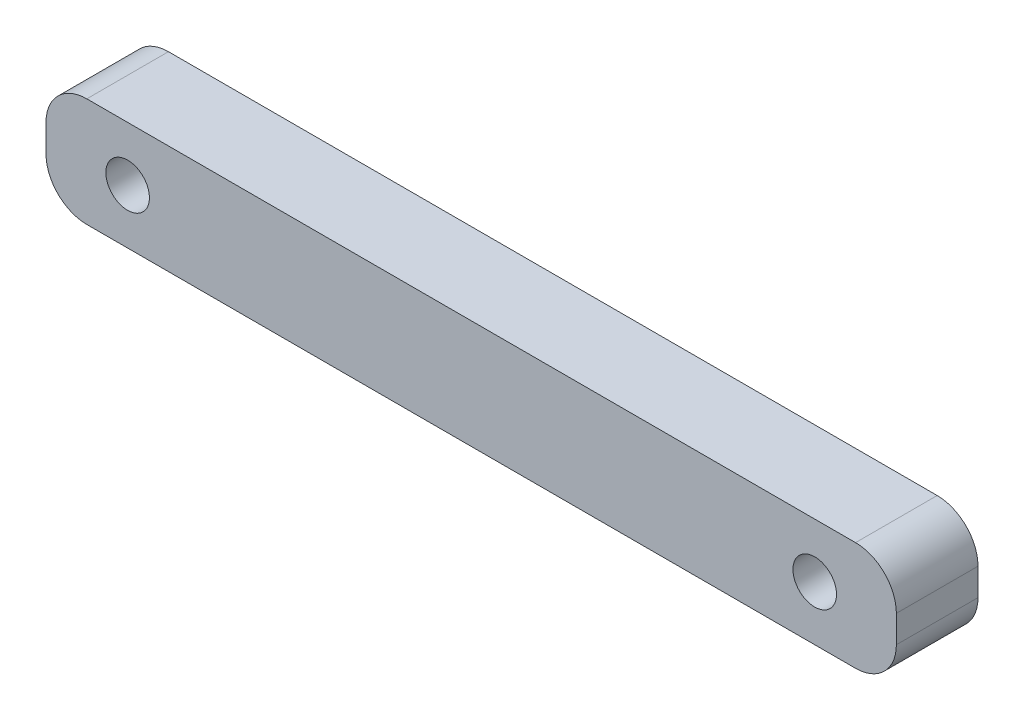
ISO-10303-21;
HEADER;
FILE_DESCRIPTION(('STEP AP214'),'2;1');
FILE_NAME('part.step','',(''),(''),'','','');
FILE_SCHEMA(('AUTOMOTIVE_DESIGN { 1 0 10303 214 1 1 1 1 }'));
ENDSEC;
DATA;
#1=APPLICATION_CONTEXT('core data for automotive mechanical design processes');
#2=APPLICATION_PROTOCOL_DEFINITION('international standard','automotive_design',2000,#1);
#3=PRODUCT_CONTEXT('',#1,'mechanical');
#4=PRODUCT('Part','Part','',(#3));
#5=PRODUCT_RELATED_PRODUCT_CATEGORY('part','',(#4));
#6=PRODUCT_DEFINITION_FORMATION('','',#4);
#7=PRODUCT_DEFINITION_CONTEXT('part definition',#1,'design');
#8=PRODUCT_DEFINITION('design','',#6,#7);
#9=PRODUCT_DEFINITION_SHAPE('','',#8);
#10=(LENGTH_UNIT() NAMED_UNIT(*) SI_UNIT(.MILLI.,.METRE.));
#11=(NAMED_UNIT(*) PLANE_ANGLE_UNIT() SI_UNIT($,.RADIAN.));
#12=(NAMED_UNIT(*) SI_UNIT($,.STERADIAN.) SOLID_ANGLE_UNIT());
#13=UNCERTAINTY_MEASURE_WITH_UNIT(LENGTH_MEASURE(1.E-05),#10,'distance_accuracy_value','');
#14=(GEOMETRIC_REPRESENTATION_CONTEXT(3) GLOBAL_UNCERTAINTY_ASSIGNED_CONTEXT((#13)) GLOBAL_UNIT_ASSIGNED_CONTEXT((#10,
#11,#12)) REPRESENTATION_CONTEXT('',''));
#15=CARTESIAN_POINT('',(0.,0.,0.));
#16=DIRECTION('',(0.,0.,1.));
#17=DIRECTION('',(1.,0.,0.));
#18=AXIS2_PLACEMENT_3D('',#15,#16,#17);
#19=CARTESIAN_POINT('',(0.,0.,6.));
#20=DIRECTION('',(1.,0.,0.));
#21=DIRECTION('',(0.,1.,0.));
#22=AXIS2_PLACEMENT_3D('',#19,#20,#21);
#23=PLANE('',#22);
#24=DIRECTION('',(0.,-1.,0.));
#25=VECTOR('',#24,1.);
#26=CARTESIAN_POINT('',(0.,0.,0.));
#27=LINE('',#26,#25);
#28=CARTESIAN_POINT('',(0.,-3.,0.));
#29=VERTEX_POINT('',#28);
#30=CARTESIAN_POINT('',(0.,-5.,0.));
#31=VERTEX_POINT('',#30);
#32=EDGE_CURVE('E129',#29,#31,#27,.T.);
#33=ORIENTED_EDGE('',*,*,#32,.T.);
#34=DIRECTION('',(0.,0.,-1.));
#35=VECTOR('',#34,1.);
#36=CARTESIAN_POINT('',(0.,-5.,6.));
#37=LINE('',#36,#35);
#38=CARTESIAN_POINT('',(0.,-5.,6.));
#39=VERTEX_POINT('',#38);
#40=EDGE_CURVE('E11',#31,#39,#37,.F.);
#41=ORIENTED_EDGE('',*,*,#40,.T.);
#42=DIRECTION('',(0.,-1.,0.));
#43=VECTOR('',#42,1.);
#44=CARTESIAN_POINT('',(0.,0.,6.));
#45=LINE('',#44,#43);
#46=CARTESIAN_POINT('',(0.,-3.,6.));
#47=VERTEX_POINT('',#46);
#48=EDGE_CURVE('E127',#47,#39,#45,.T.);
#49=ORIENTED_EDGE('',*,*,#48,.F.);
#50=DIRECTION('',(0.,0.,-1.));
#51=VECTOR('',#50,1.);
#52=CARTESIAN_POINT('',(0.,-3.,6.));
#53=LINE('',#52,#51);
#54=EDGE_CURVE('E41',#47,#29,#53,.T.);
#55=ORIENTED_EDGE('',*,*,#54,.T.);
#56=EDGE_LOOP('',(#33,#41,#49,#55));
#57=FACE_BOUND('',#56,.T.);
#58=ADVANCED_FACE('F33',(#57),#23,.F.);
#59=CARTESIAN_POINT('',(0.,-8.,6.));
#60=DIRECTION('',(0.,1.,0.));
#61=DIRECTION('',(0.,0.,1.));
#62=AXIS2_PLACEMENT_3D('',#59,#60,#61);
#63=PLANE('',#62);
#64=DIRECTION('',(1.,0.,0.));
#65=VECTOR('',#64,1.);
#66=CARTESIAN_POINT('',(0.,-8.,0.));
#67=LINE('',#66,#65);
#68=CARTESIAN_POINT('',(3.,-8.,0.));
#69=VERTEX_POINT('',#68);
#70=CARTESIAN_POINT('',(59.5,-8.,0.));
#71=VERTEX_POINT('',#70);
#72=EDGE_CURVE('E125',#69,#71,#67,.T.);
#73=ORIENTED_EDGE('',*,*,#72,.T.);
#74=DIRECTION('',(0.,0.,-1.));
#75=VECTOR('',#74,1.);
#76=CARTESIAN_POINT('',(59.5,-8.,6.));
#77=LINE('',#76,#75);
#78=CARTESIAN_POINT('',(59.5,-8.,6.));
#79=VERTEX_POINT('',#78);
#80=EDGE_CURVE('E104',#71,#79,#77,.F.);
#81=ORIENTED_EDGE('',*,*,#80,.T.);
#82=DIRECTION('',(1.,0.,0.));
#83=VECTOR('',#82,1.);
#84=CARTESIAN_POINT('',(0.,-8.,6.));
#85=LINE('',#84,#83);
#86=CARTESIAN_POINT('',(3.,-8.,6.));
#87=VERTEX_POINT('',#86);
#88=EDGE_CURVE('E169',#87,#79,#85,.T.);
#89=ORIENTED_EDGE('',*,*,#88,.F.);
#90=DIRECTION('',(0.,0.,-1.));
#91=VECTOR('',#90,1.);
#92=CARTESIAN_POINT('',(3.,-8.,6.));
#93=LINE('',#92,#91);
#94=EDGE_CURVE('E109',#87,#69,#93,.T.);
#95=ORIENTED_EDGE('',*,*,#94,.T.);
#96=EDGE_LOOP('',(#73,#81,#89,#95));
#97=FACE_BOUND('',#96,.T.);
#98=ADVANCED_FACE('F201',(#97),#63,.F.);
#99=CARTESIAN_POINT('',(62.5,0.,6.));
#100=DIRECTION('',(-1.,0.,0.));
#101=DIRECTION('',(0.,0.,1.));
#102=AXIS2_PLACEMENT_3D('',#99,#100,#101);
#103=PLANE('',#102);
#104=DIRECTION('',(0.,1.,0.));
#105=VECTOR('',#104,1.);
#106=CARTESIAN_POINT('',(62.5,0.,6.));
#107=LINE('',#106,#105);
#108=CARTESIAN_POINT('',(62.5,-5.,6.));
#109=VERTEX_POINT('',#108);
#110=CARTESIAN_POINT('',(62.5,-3.,6.));
#111=VERTEX_POINT('',#110);
#112=EDGE_CURVE('E118',#109,#111,#107,.T.);
#113=ORIENTED_EDGE('',*,*,#112,.F.);
#114=DIRECTION('',(0.,0.,-1.));
#115=VECTOR('',#114,1.);
#116=CARTESIAN_POINT('',(62.5,-5.,6.));
#117=LINE('',#116,#115);
#118=CARTESIAN_POINT('',(62.5,-5.,0.));
#119=VERTEX_POINT('',#118);
#120=EDGE_CURVE('E103',#109,#119,#117,.T.);
#121=ORIENTED_EDGE('',*,*,#120,.T.);
#122=DIRECTION('',(0.,1.,0.));
#123=VECTOR('',#122,1.);
#124=CARTESIAN_POINT('',(62.5,0.,0.));
#125=LINE('',#124,#123);
#126=CARTESIAN_POINT('',(62.5,-3.,0.));
#127=VERTEX_POINT('',#126);
#128=EDGE_CURVE('E116',#119,#127,#125,.T.);
#129=ORIENTED_EDGE('',*,*,#128,.T.);
#130=DIRECTION('',(0.,0.,-1.));
#131=VECTOR('',#130,1.);
#132=CARTESIAN_POINT('',(62.5,-3.,6.));
#133=LINE('',#132,#131);
#134=EDGE_CURVE('E120',#127,#111,#133,.F.);
#135=ORIENTED_EDGE('',*,*,#134,.T.);
#136=EDGE_LOOP('',(#113,#121,#129,#135));
#137=FACE_BOUND('',#136,.T.);
#138=ADVANCED_FACE('F115',(#137),#103,.F.);
#139=CARTESIAN_POINT('',(0.,0.,6.));
#140=DIRECTION('',(0.,-1.,0.));
#141=DIRECTION('',(0.,0.,-1.));
#142=AXIS2_PLACEMENT_3D('',#139,#140,#141);
#143=PLANE('',#142);
#144=DIRECTION('',(-1.,0.,0.));
#145=VECTOR('',#144,1.);
#146=CARTESIAN_POINT('',(0.,0.,6.));
#147=LINE('',#146,#145);
#148=CARTESIAN_POINT('',(59.5,0.,6.));
#149=VERTEX_POINT('',#148);
#150=CARTESIAN_POINT('',(3.,0.,6.));
#151=VERTEX_POINT('',#150);
#152=EDGE_CURVE('E133',#149,#151,#147,.T.);
#153=ORIENTED_EDGE('',*,*,#152,.F.);
#154=DIRECTION('',(0.,0.,-1.));
#155=VECTOR('',#154,1.);
#156=CARTESIAN_POINT('',(59.5,0.,6.));
#157=LINE('',#156,#155);
#158=CARTESIAN_POINT('',(59.5,0.,0.));
#159=VERTEX_POINT('',#158);
#160=EDGE_CURVE('E150',#149,#159,#157,.T.);
#161=ORIENTED_EDGE('',*,*,#160,.T.);
#162=DIRECTION('',(-1.,0.,0.));
#163=VECTOR('',#162,1.);
#164=CARTESIAN_POINT('',(0.,0.,0.));
#165=LINE('',#164,#163);
#166=CARTESIAN_POINT('',(3.,0.,0.));
#167=VERTEX_POINT('',#166);
#168=EDGE_CURVE('E124',#159,#167,#165,.T.);
#169=ORIENTED_EDGE('',*,*,#168,.T.);
#170=DIRECTION('',(0.,0.,-1.));
#171=VECTOR('',#170,1.);
#172=CARTESIAN_POINT('',(3.,0.,6.));
#173=LINE('',#172,#171);
#174=EDGE_CURVE('E48',#167,#151,#173,.F.);
#175=ORIENTED_EDGE('',*,*,#174,.T.);
#176=EDGE_LOOP('',(#153,#161,#169,#175));
#177=FACE_BOUND('',#176,.T.);
#178=ADVANCED_FACE('F194',(#177),#143,.F.);
#179=CARTESIAN_POINT('',(0.,0.,6.));
#180=DIRECTION('',(0.,0.,1.));
#181=DIRECTION('',(1.,0.,0.));
#182=AXIS2_PLACEMENT_3D('',#179,#180,#181);
#183=PLANE('',#182);
#184=CARTESIAN_POINT('',(6.,-4.,6.));
#185=DIRECTION('',(0.,0.,1.));
#186=DIRECTION('',(1.,0.,0.));
#187=AXIS2_PLACEMENT_3D('',#184,#185,#186);
#188=CIRCLE('',#187,1.6);
#189=CARTESIAN_POINT('',(7.6,-4.,6.));
#190=VERTEX_POINT('',#189);
#191=EDGE_CURVE('E176',#190,#190,#188,.T.);
#192=ORIENTED_EDGE('',*,*,#191,.F.);
#193=EDGE_LOOP('',(#192));
#194=FACE_BOUND('',#193,.T.);
#195=CARTESIAN_POINT('',(56.5,-4.,6.));
#196=DIRECTION('',(0.,0.,1.));
#197=DIRECTION('',(1.,0.,0.));
#198=AXIS2_PLACEMENT_3D('',#195,#196,#197);
#199=CIRCLE('',#198,1.6);
#200=CARTESIAN_POINT('',(58.1,-4.,6.));
#201=VERTEX_POINT('',#200);
#202=EDGE_CURVE('E164',#201,#201,#199,.T.);
#203=ORIENTED_EDGE('',*,*,#202,.F.);
#204=EDGE_LOOP('',(#203));
#205=FACE_BOUND('',#204,.T.);
#206=ORIENTED_EDGE('',*,*,#88,.T.);
#207=CARTESIAN_POINT('',(59.5,-5.,6.));
#208=DIRECTION('',(0.,0.,1.));
#209=DIRECTION('',(1.,0.,0.));
#210=AXIS2_PLACEMENT_3D('',#207,#208,#209);
#211=CIRCLE('',#210,3.);
#212=EDGE_CURVE('E147',#79,#109,#211,.T.);
#213=ORIENTED_EDGE('',*,*,#212,.T.);
#214=ORIENTED_EDGE('',*,*,#112,.T.);
#215=CARTESIAN_POINT('',(59.5,-3.,6.));
#216=DIRECTION('',(0.,0.,1.));
#217=DIRECTION('',(1.,0.,0.));
#218=AXIS2_PLACEMENT_3D('',#215,#216,#217);
#219=CIRCLE('',#218,3.);
#220=EDGE_CURVE('E55',#111,#149,#219,.T.);
#221=ORIENTED_EDGE('',*,*,#220,.T.);
#222=ORIENTED_EDGE('',*,*,#152,.T.);
#223=CARTESIAN_POINT('',(3.,-3.,6.));
#224=DIRECTION('',(0.,0.,1.));
#225=DIRECTION('',(1.,0.,0.));
#226=AXIS2_PLACEMENT_3D('',#223,#224,#225);
#227=CIRCLE('',#226,3.);
#228=EDGE_CURVE('E142',#151,#47,#227,.T.);
#229=ORIENTED_EDGE('',*,*,#228,.T.);
#230=ORIENTED_EDGE('',*,*,#48,.T.);
#231=CARTESIAN_POINT('',(3.,-5.,6.));
#232=DIRECTION('',(0.,0.,1.));
#233=DIRECTION('',(1.,0.,0.));
#234=AXIS2_PLACEMENT_3D('',#231,#232,#233);
#235=CIRCLE('',#234,3.);
#236=EDGE_CURVE('E144',#39,#87,#235,.T.);
#237=ORIENTED_EDGE('',*,*,#236,.T.);
#238=EDGE_LOOP('',(#206,#213,#214,#221,#222,#229,#230,#237));
#239=FACE_BOUND('',#238,.T.);
#240=ADVANCED_FACE('F191',(#194,#205,#239),#183,.T.);
#241=CARTESIAN_POINT('',(0.,0.,0.));
#242=DIRECTION('',(0.,0.,1.));
#243=DIRECTION('',(1.,0.,0.));
#244=AXIS2_PLACEMENT_3D('',#241,#242,#243);
#245=PLANE('',#244);
#246=CARTESIAN_POINT('',(6.,-4.,0.));
#247=DIRECTION('',(0.,0.,1.));
#248=DIRECTION('',(1.,0.,0.));
#249=AXIS2_PLACEMENT_3D('',#246,#247,#248);
#250=CIRCLE('',#249,1.6);
#251=CARTESIAN_POINT('',(7.6,-4.,0.));
#252=VERTEX_POINT('',#251);
#253=EDGE_CURVE('E174',#252,#252,#250,.T.);
#254=ORIENTED_EDGE('',*,*,#253,.T.);
#255=EDGE_LOOP('',(#254));
#256=FACE_BOUND('',#255,.T.);
#257=CARTESIAN_POINT('',(56.5,-4.,0.));
#258=DIRECTION('',(0.,0.,1.));
#259=DIRECTION('',(1.,0.,0.));
#260=AXIS2_PLACEMENT_3D('',#257,#258,#259);
#261=CIRCLE('',#260,1.6);
#262=CARTESIAN_POINT('',(58.1,-4.,0.));
#263=VERTEX_POINT('',#262);
#264=EDGE_CURVE('E162',#263,#263,#261,.T.);
#265=ORIENTED_EDGE('',*,*,#264,.T.);
#266=EDGE_LOOP('',(#265));
#267=FACE_BOUND('',#266,.T.);
#268=ORIENTED_EDGE('',*,*,#128,.F.);
#269=CARTESIAN_POINT('',(59.5,-5.,0.));
#270=DIRECTION('',(0.,0.,1.));
#271=DIRECTION('',(1.,0.,0.));
#272=AXIS2_PLACEMENT_3D('',#269,#270,#271);
#273=CIRCLE('',#272,3.);
#274=EDGE_CURVE('E99',#119,#71,#273,.F.);
#275=ORIENTED_EDGE('',*,*,#274,.T.);
#276=ORIENTED_EDGE('',*,*,#72,.F.);
#277=CARTESIAN_POINT('',(3.,-5.,0.));
#278=DIRECTION('',(0.,0.,1.));
#279=DIRECTION('',(1.,0.,0.));
#280=AXIS2_PLACEMENT_3D('',#277,#278,#279);
#281=CIRCLE('',#280,3.);
#282=EDGE_CURVE('E136',#69,#31,#281,.F.);
#283=ORIENTED_EDGE('',*,*,#282,.T.);
#284=ORIENTED_EDGE('',*,*,#32,.F.);
#285=CARTESIAN_POINT('',(3.,-3.,0.));
#286=DIRECTION('',(0.,0.,1.));
#287=DIRECTION('',(1.,0.,0.));
#288=AXIS2_PLACEMENT_3D('',#285,#286,#287);
#289=CIRCLE('',#288,3.);
#290=EDGE_CURVE('E119',#29,#167,#289,.F.);
#291=ORIENTED_EDGE('',*,*,#290,.T.);
#292=ORIENTED_EDGE('',*,*,#168,.F.);
#293=CARTESIAN_POINT('',(59.5,-3.,0.));
#294=DIRECTION('',(0.,0.,1.));
#295=DIRECTION('',(1.,0.,0.));
#296=AXIS2_PLACEMENT_3D('',#293,#294,#295);
#297=CIRCLE('',#296,3.);
#298=EDGE_CURVE('E110',#159,#127,#297,.F.);
#299=ORIENTED_EDGE('',*,*,#298,.T.);
#300=EDGE_LOOP('',(#268,#275,#276,#283,#284,#291,#292,#299));
#301=FACE_BOUND('',#300,.T.);
#302=ADVANCED_FACE('F122',(#256,#267,#301),#245,.F.);
#303=CARTESIAN_POINT('',(56.5,-4.,0.));
#304=DIRECTION('',(0.,0.,1.));
#305=DIRECTION('',(1.,0.,0.));
#306=AXIS2_PLACEMENT_3D('',#303,#304,#305);
#307=CYLINDRICAL_SURFACE('',#306,1.6);
#308=ORIENTED_EDGE('',*,*,#264,.F.);
#309=EDGE_LOOP('',(#308));
#310=FACE_BOUND('',#309,.T.);
#311=ORIENTED_EDGE('',*,*,#202,.T.);
#312=EDGE_LOOP('',(#311));
#313=FACE_BOUND('',#312,.T.);
#314=ADVANCED_FACE('F187',(#310,#313),#307,.F.);
#315=CARTESIAN_POINT('',(6.,-4.,0.));
#316=DIRECTION('',(0.,0.,1.));
#317=DIRECTION('',(1.,0.,0.));
#318=AXIS2_PLACEMENT_3D('',#315,#316,#317);
#319=CYLINDRICAL_SURFACE('',#318,1.6);
#320=ORIENTED_EDGE('',*,*,#253,.F.);
#321=EDGE_LOOP('',(#320));
#322=FACE_BOUND('',#321,.T.);
#323=ORIENTED_EDGE('',*,*,#191,.T.);
#324=EDGE_LOOP('',(#323));
#325=FACE_BOUND('',#324,.T.);
#326=ADVANCED_FACE('F184',(#322,#325),#319,.F.);
#327=CARTESIAN_POINT('',(59.5,-5.,6.));
#328=DIRECTION('',(0.,0.,-1.));
#329=DIRECTION('',(-1.,0.,0.));
#330=AXIS2_PLACEMENT_3D('',#327,#328,#329);
#331=CYLINDRICAL_SURFACE('',#330,3.);
#332=ORIENTED_EDGE('',*,*,#212,.F.);
#333=ORIENTED_EDGE('',*,*,#80,.F.);
#334=ORIENTED_EDGE('',*,*,#274,.F.);
#335=ORIENTED_EDGE('',*,*,#120,.F.);
#336=EDGE_LOOP('',(#332,#333,#334,#335));
#337=FACE_BOUND('',#336,.T.);
#338=ADVANCED_FACE('F102',(#337),#331,.T.);
#339=CARTESIAN_POINT('',(59.5,-3.,6.));
#340=DIRECTION('',(0.,0.,-1.));
#341=DIRECTION('',(-1.,0.,0.));
#342=AXIS2_PLACEMENT_3D('',#339,#340,#341);
#343=CYLINDRICAL_SURFACE('',#342,3.);
#344=ORIENTED_EDGE('',*,*,#220,.F.);
#345=ORIENTED_EDGE('',*,*,#134,.F.);
#346=ORIENTED_EDGE('',*,*,#298,.F.);
#347=ORIENTED_EDGE('',*,*,#160,.F.);
#348=EDGE_LOOP('',(#344,#345,#346,#347));
#349=FACE_BOUND('',#348,.T.);
#350=ADVANCED_FACE('F208',(#349),#343,.T.);
#351=CARTESIAN_POINT('',(3.,-5.,6.));
#352=DIRECTION('',(0.,0.,-1.));
#353=DIRECTION('',(-1.,0.,0.));
#354=AXIS2_PLACEMENT_3D('',#351,#352,#353);
#355=CYLINDRICAL_SURFACE('',#354,3.);
#356=ORIENTED_EDGE('',*,*,#236,.F.);
#357=ORIENTED_EDGE('',*,*,#40,.F.);
#358=ORIENTED_EDGE('',*,*,#282,.F.);
#359=ORIENTED_EDGE('',*,*,#94,.F.);
#360=EDGE_LOOP('',(#356,#357,#358,#359));
#361=FACE_BOUND('',#360,.T.);
#362=ADVANCED_FACE('F203',(#361),#355,.T.);
#363=CARTESIAN_POINT('',(3.,-3.,6.));
#364=DIRECTION('',(0.,0.,-1.));
#365=DIRECTION('',(-1.,0.,0.));
#366=AXIS2_PLACEMENT_3D('',#363,#364,#365);
#367=CYLINDRICAL_SURFACE('',#366,3.);
#368=ORIENTED_EDGE('',*,*,#228,.F.);
#369=ORIENTED_EDGE('',*,*,#174,.F.);
#370=ORIENTED_EDGE('',*,*,#290,.F.);
#371=ORIENTED_EDGE('',*,*,#54,.F.);
#372=EDGE_LOOP('',(#368,#369,#370,#371));
#373=FACE_BOUND('',#372,.T.);
#374=ADVANCED_FACE('F35',(#373),#367,.T.);
#375=CLOSED_SHELL('',(#58,#98,#138,#178,#240,#302,#314,#326,#338,#350,#362,#374));
#376=MANIFOLD_SOLID_BREP('B2',#375);
#377=ADVANCED_BREP_SHAPE_REPRESENTATION('',(#18,#376),#14);
#378=SHAPE_DEFINITION_REPRESENTATION(#9,#377);
ENDSEC;
END-ISO-10303-21;
